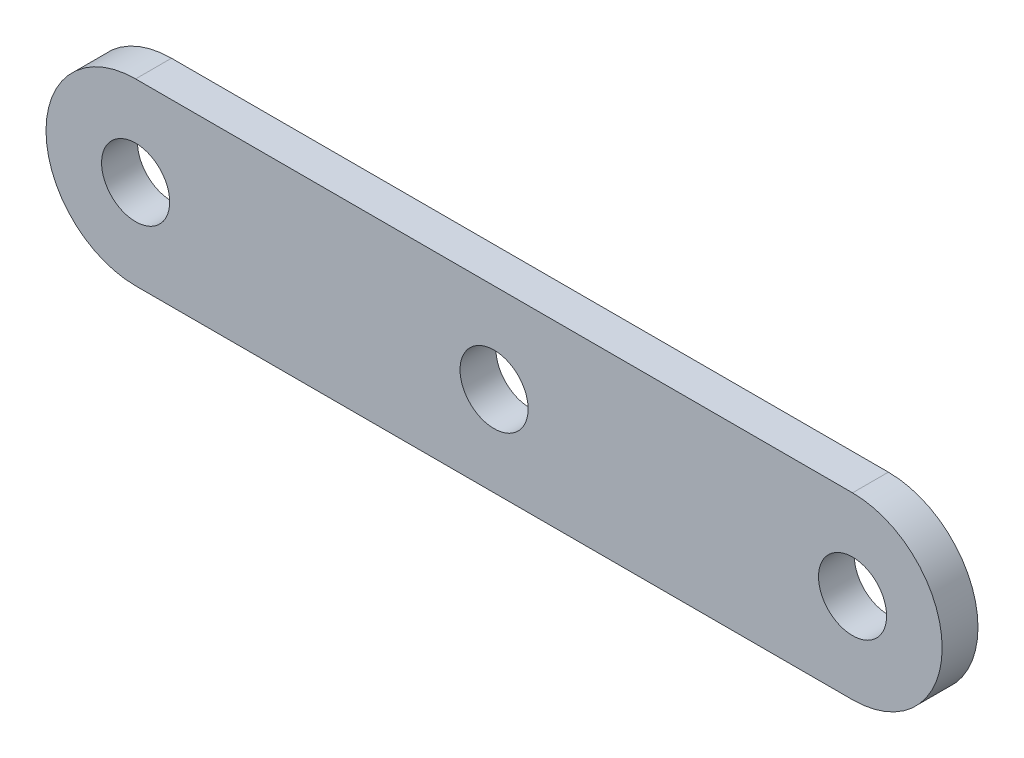
ISO-10303-21;
HEADER;
FILE_DESCRIPTION(('STEP AP214'),'2;1');
FILE_NAME('part.step','',(''),(''),'','','');
FILE_SCHEMA(('AUTOMOTIVE_DESIGN { 1 0 10303 214 1 1 1 1 }'));
ENDSEC;
DATA;
#1=APPLICATION_CONTEXT('core data for automotive mechanical design processes');
#2=APPLICATION_PROTOCOL_DEFINITION('international standard','automotive_design',2000,#1);
#3=PRODUCT_CONTEXT('',#1,'mechanical');
#4=PRODUCT('Part','Part','',(#3));
#5=PRODUCT_RELATED_PRODUCT_CATEGORY('part','',(#4));
#6=PRODUCT_DEFINITION_FORMATION('','',#4);
#7=PRODUCT_DEFINITION_CONTEXT('part definition',#1,'design');
#8=PRODUCT_DEFINITION('design','',#6,#7);
#9=PRODUCT_DEFINITION_SHAPE('','',#8);
#10=(LENGTH_UNIT() NAMED_UNIT(*) SI_UNIT(.MILLI.,.METRE.));
#11=(NAMED_UNIT(*) PLANE_ANGLE_UNIT() SI_UNIT($,.RADIAN.));
#12=(NAMED_UNIT(*) SI_UNIT($,.STERADIAN.) SOLID_ANGLE_UNIT());
#13=UNCERTAINTY_MEASURE_WITH_UNIT(LENGTH_MEASURE(1.E-05),#10,'distance_accuracy_value','');
#14=(GEOMETRIC_REPRESENTATION_CONTEXT(3) GLOBAL_UNCERTAINTY_ASSIGNED_CONTEXT((#13)) GLOBAL_UNIT_ASSIGNED_CONTEXT((#10,
#11,#12)) REPRESENTATION_CONTEXT('',''));
#15=CARTESIAN_POINT('',(0.,0.,0.));
#16=DIRECTION('',(0.,0.,1.));
#17=DIRECTION('',(1.,0.,0.));
#18=AXIS2_PLACEMENT_3D('',#15,#16,#17);
#19=CARTESIAN_POINT('',(-2.54,-5.81121212121212,1.27));
#20=DIRECTION('',(0.,0.,-1.));
#21=DIRECTION('',(-1.,0.,0.));
#22=AXIS2_PLACEMENT_3D('',#19,#20,#21);
#23=CYLINDRICAL_SURFACE('',#22,6.35);
#24=CARTESIAN_POINT('',(-2.54,-5.81121212121212,-1.27));
#25=DIRECTION('',(0.,0.,1.));
#26=DIRECTION('',(1.,0.,0.));
#27=AXIS2_PLACEMENT_3D('',#24,#25,#26);
#28=CIRCLE('',#27,6.35);
#29=CARTESIAN_POINT('',(-2.54,0.538787878787879,-1.27));
#30=VERTEX_POINT('',#29);
#31=CARTESIAN_POINT('',(-2.54,-12.1612121212121,-1.27));
#32=VERTEX_POINT('',#31);
#33=EDGE_CURVE('E104',#30,#32,#28,.T.);
#34=ORIENTED_EDGE('',*,*,#33,.T.);
#35=DIRECTION('',(0.,0.,-1.));
#36=VECTOR('',#35,1.);
#37=CARTESIAN_POINT('',(-2.54,-12.1612121212121,1.27));
#38=LINE('',#37,#36);
#39=CARTESIAN_POINT('',(-2.54,-12.1612121212121,1.27));
#40=VERTEX_POINT('',#39);
#41=EDGE_CURVE('E11',#40,#32,#38,.T.);
#42=ORIENTED_EDGE('',*,*,#41,.F.);
#43=CARTESIAN_POINT('',(-2.54,-5.81121212121212,1.27));
#44=DIRECTION('',(0.,0.,1.));
#45=DIRECTION('',(1.,0.,0.));
#46=AXIS2_PLACEMENT_3D('',#43,#44,#45);
#47=CIRCLE('',#46,6.35);
#48=CARTESIAN_POINT('',(-2.54,0.538787878787879,1.27));
#49=VERTEX_POINT('',#48);
#50=EDGE_CURVE('E92',#49,#40,#47,.T.);
#51=ORIENTED_EDGE('',*,*,#50,.F.);
#52=DIRECTION('',(0.,0.,-1.));
#53=VECTOR('',#52,1.);
#54=CARTESIAN_POINT('',(-2.54,0.538787878787879,1.27));
#55=LINE('',#54,#53);
#56=EDGE_CURVE('E100',#49,#30,#55,.T.);
#57=ORIENTED_EDGE('',*,*,#56,.T.);
#58=EDGE_LOOP('',(#34,#42,#51,#57));
#59=FACE_BOUND('',#58,.T.);
#60=ADVANCED_FACE('F41',(#59),#23,.T.);
#61=CARTESIAN_POINT('',(48.26,-12.1612121212121,1.27));
#62=DIRECTION('',(0.,1.,0.));
#63=DIRECTION('',(-1.,0.,0.));
#64=AXIS2_PLACEMENT_3D('',#61,#62,#63);
#65=PLANE('',#64);
#66=DIRECTION('',(1.,0.,0.));
#67=VECTOR('',#66,1.);
#68=CARTESIAN_POINT('',(48.26,-12.1612121212121,-1.27));
#69=LINE('',#68,#67);
#70=CARTESIAN_POINT('',(48.26,-12.1612121212121,-1.27));
#71=VERTEX_POINT('',#70);
#72=EDGE_CURVE('E96',#32,#71,#69,.T.);
#73=ORIENTED_EDGE('',*,*,#72,.T.);
#74=DIRECTION('',(0.,0.,-1.));
#75=VECTOR('',#74,1.);
#76=CARTESIAN_POINT('',(48.26,-12.1612121212121,1.27));
#77=LINE('',#76,#75);
#78=CARTESIAN_POINT('',(48.26,-12.1612121212121,1.27));
#79=VERTEX_POINT('',#78);
#80=EDGE_CURVE('E49',#79,#71,#77,.T.);
#81=ORIENTED_EDGE('',*,*,#80,.F.);
#82=DIRECTION('',(1.,0.,0.));
#83=VECTOR('',#82,1.);
#84=CARTESIAN_POINT('',(48.26,-12.1612121212121,1.27));
#85=LINE('',#84,#83);
#86=EDGE_CURVE('E87',#40,#79,#85,.T.);
#87=ORIENTED_EDGE('',*,*,#86,.F.);
#88=ORIENTED_EDGE('',*,*,#41,.T.);
#89=EDGE_LOOP('',(#73,#81,#87,#88));
#90=FACE_BOUND('',#89,.T.);
#91=ADVANCED_FACE('F95',(#90),#65,.F.);
#92=CARTESIAN_POINT('',(48.26,-5.81121212121212,1.27));
#93=DIRECTION('',(0.,0.,-1.));
#94=DIRECTION('',(-1.,0.,0.));
#95=AXIS2_PLACEMENT_3D('',#92,#93,#94);
#96=CYLINDRICAL_SURFACE('',#95,6.35);
#97=CARTESIAN_POINT('',(48.26,-5.81121212121212,-1.27));
#98=DIRECTION('',(0.,0.,1.));
#99=DIRECTION('',(-1.,0.,0.));
#100=AXIS2_PLACEMENT_3D('',#97,#98,#99);
#101=CIRCLE('',#100,6.35);
#102=CARTESIAN_POINT('',(48.26,0.538787878787884,-1.27));
#103=VERTEX_POINT('',#102);
#104=EDGE_CURVE('E74',#71,#103,#101,.T.);
#105=ORIENTED_EDGE('',*,*,#104,.T.);
#106=DIRECTION('',(0.,0.,-1.));
#107=VECTOR('',#106,1.);
#108=CARTESIAN_POINT('',(48.26,0.538787878787884,1.27));
#109=LINE('',#108,#107);
#110=CARTESIAN_POINT('',(48.26,0.538787878787884,1.27));
#111=VERTEX_POINT('',#110);
#112=EDGE_CURVE('E97',#111,#103,#109,.T.);
#113=ORIENTED_EDGE('',*,*,#112,.F.);
#114=CARTESIAN_POINT('',(48.26,-5.81121212121212,1.27));
#115=DIRECTION('',(0.,0.,1.));
#116=DIRECTION('',(-1.,0.,0.));
#117=AXIS2_PLACEMENT_3D('',#114,#115,#116);
#118=CIRCLE('',#117,6.35);
#119=EDGE_CURVE('E90',#79,#111,#118,.T.);
#120=ORIENTED_EDGE('',*,*,#119,.F.);
#121=ORIENTED_EDGE('',*,*,#80,.T.);
#122=EDGE_LOOP('',(#105,#113,#120,#121));
#123=FACE_BOUND('',#122,.T.);
#124=ADVANCED_FACE('F98',(#123),#96,.T.);
#125=CARTESIAN_POINT('',(48.26,0.538787878787884,1.27));
#126=DIRECTION('',(0.,-1.,0.));
#127=DIRECTION('',(1.,0.,0.));
#128=AXIS2_PLACEMENT_3D('',#125,#126,#127);
#129=PLANE('',#128);
#130=DIRECTION('',(-1.,0.,0.));
#131=VECTOR('',#130,1.);
#132=CARTESIAN_POINT('',(48.26,0.538787878787884,-1.27));
#133=LINE('',#132,#131);
#134=EDGE_CURVE('E80',#103,#30,#133,.T.);
#135=ORIENTED_EDGE('',*,*,#134,.T.);
#136=ORIENTED_EDGE('',*,*,#56,.F.);
#137=DIRECTION('',(-1.,0.,0.));
#138=VECTOR('',#137,1.);
#139=CARTESIAN_POINT('',(48.26,0.538787878787884,1.27));
#140=LINE('',#139,#138);
#141=EDGE_CURVE('E57',#111,#49,#140,.T.);
#142=ORIENTED_EDGE('',*,*,#141,.F.);
#143=ORIENTED_EDGE('',*,*,#112,.T.);
#144=EDGE_LOOP('',(#135,#136,#142,#143));
#145=FACE_BOUND('',#144,.T.);
#146=ADVANCED_FACE('F112',(#145),#129,.F.);
#147=CARTESIAN_POINT('',(-2.54,-5.81121212121212,1.27));
#148=DIRECTION('',(0.,0.,1.));
#149=DIRECTION('',(1.,0.,0.));
#150=AXIS2_PLACEMENT_3D('',#147,#148,#149);
#151=PLANE('',#150);
#152=CARTESIAN_POINT('',(22.86,-5.81121212121212,1.27));
#153=DIRECTION('',(0.,0.,1.));
#154=DIRECTION('',(1.,0.,0.));
#155=AXIS2_PLACEMENT_3D('',#152,#153,#154);
#156=CIRCLE('',#155,2.413);
#157=CARTESIAN_POINT('',(25.273,-5.81121212121212,1.27));
#158=VERTEX_POINT('',#157);
#159=EDGE_CURVE('E130',#158,#158,#156,.T.);
#160=ORIENTED_EDGE('',*,*,#159,.F.);
#161=EDGE_LOOP('',(#160));
#162=FACE_BOUND('',#161,.T.);
#163=CARTESIAN_POINT('',(48.26,-5.81121212121212,1.27));
#164=DIRECTION('',(0.,0.,1.));
#165=DIRECTION('',(1.,0.,0.));
#166=AXIS2_PLACEMENT_3D('',#163,#164,#165);
#167=CIRCLE('',#166,2.413);
#168=CARTESIAN_POINT('',(50.673,-5.81121212121212,1.27));
#169=VERTEX_POINT('',#168);
#170=EDGE_CURVE('E124',#169,#169,#167,.T.);
#171=ORIENTED_EDGE('',*,*,#170,.F.);
#172=EDGE_LOOP('',(#171));
#173=FACE_BOUND('',#172,.T.);
#174=CARTESIAN_POINT('',(-2.54,-5.81121212121212,1.27));
#175=DIRECTION('',(0.,0.,1.));
#176=DIRECTION('',(1.,0.,0.));
#177=AXIS2_PLACEMENT_3D('',#174,#175,#176);
#178=CIRCLE('',#177,2.413);
#179=CARTESIAN_POINT('',(-0.127,-5.81121212121212,1.27));
#180=VERTEX_POINT('',#179);
#181=EDGE_CURVE('E118',#180,#180,#178,.T.);
#182=ORIENTED_EDGE('',*,*,#181,.F.);
#183=EDGE_LOOP('',(#182));
#184=FACE_BOUND('',#183,.T.);
#185=ORIENTED_EDGE('',*,*,#50,.T.);
#186=ORIENTED_EDGE('',*,*,#86,.T.);
#187=ORIENTED_EDGE('',*,*,#119,.T.);
#188=ORIENTED_EDGE('',*,*,#141,.T.);
#189=EDGE_LOOP('',(#185,#186,#187,#188));
#190=FACE_BOUND('',#189,.T.);
#191=ADVANCED_FACE('F88',(#162,#173,#184,#190),#151,.T.);
#192=CARTESIAN_POINT('',(-2.54,-5.81121212121212,-1.27));
#193=DIRECTION('',(0.,0.,1.));
#194=DIRECTION('',(1.,0.,0.));
#195=AXIS2_PLACEMENT_3D('',#192,#193,#194);
#196=PLANE('',#195);
#197=CARTESIAN_POINT('',(22.86,-5.81121212121212,-1.27));
#198=DIRECTION('',(0.,0.,1.));
#199=DIRECTION('',(1.,0.,0.));
#200=AXIS2_PLACEMENT_3D('',#197,#198,#199);
#201=CIRCLE('',#200,2.413);
#202=CARTESIAN_POINT('',(25.273,-5.81121212121212,-1.27));
#203=VERTEX_POINT('',#202);
#204=EDGE_CURVE('E121',#203,#203,#201,.T.);
#205=ORIENTED_EDGE('',*,*,#204,.T.);
#206=EDGE_LOOP('',(#205));
#207=FACE_BOUND('',#206,.T.);
#208=CARTESIAN_POINT('',(48.26,-5.81121212121212,-1.27));
#209=DIRECTION('',(0.,0.,1.));
#210=DIRECTION('',(1.,0.,0.));
#211=AXIS2_PLACEMENT_3D('',#208,#209,#210);
#212=CIRCLE('',#211,2.413);
#213=CARTESIAN_POINT('',(50.673,-5.81121212121212,-1.27));
#214=VERTEX_POINT('',#213);
#215=EDGE_CURVE('E127',#214,#214,#212,.T.);
#216=ORIENTED_EDGE('',*,*,#215,.T.);
#217=EDGE_LOOP('',(#216));
#218=FACE_BOUND('',#217,.T.);
#219=CARTESIAN_POINT('',(-2.54,-5.81121212121212,-1.27));
#220=DIRECTION('',(0.,0.,1.));
#221=DIRECTION('',(1.,0.,0.));
#222=AXIS2_PLACEMENT_3D('',#219,#220,#221);
#223=CIRCLE('',#222,2.413);
#224=CARTESIAN_POINT('',(-0.127,-5.81121212121212,-1.27));
#225=VERTEX_POINT('',#224);
#226=EDGE_CURVE('E107',#225,#225,#223,.T.);
#227=ORIENTED_EDGE('',*,*,#226,.T.);
#228=EDGE_LOOP('',(#227));
#229=FACE_BOUND('',#228,.T.);
#230=ORIENTED_EDGE('',*,*,#33,.F.);
#231=ORIENTED_EDGE('',*,*,#134,.F.);
#232=ORIENTED_EDGE('',*,*,#104,.F.);
#233=ORIENTED_EDGE('',*,*,#72,.F.);
#234=EDGE_LOOP('',(#230,#231,#232,#233));
#235=FACE_BOUND('',#234,.T.);
#236=ADVANCED_FACE('F115',(#207,#218,#229,#235),#196,.F.);
#237=CARTESIAN_POINT('',(-2.54,-5.81121212121212,-1.27));
#238=DIRECTION('',(0.,0.,1.));
#239=DIRECTION('',(1.,0.,0.));
#240=AXIS2_PLACEMENT_3D('',#237,#238,#239);
#241=CYLINDRICAL_SURFACE('',#240,2.413);
#242=ORIENTED_EDGE('',*,*,#226,.F.);
#243=EDGE_LOOP('',(#242));
#244=FACE_BOUND('',#243,.T.);
#245=ORIENTED_EDGE('',*,*,#181,.T.);
#246=EDGE_LOOP('',(#245));
#247=FACE_BOUND('',#246,.T.);
#248=ADVANCED_FACE('F152',(#244,#247),#241,.F.);
#249=CARTESIAN_POINT('',(48.26,-5.81121212121212,-1.27));
#250=DIRECTION('',(0.,0.,1.));
#251=DIRECTION('',(1.,0.,0.));
#252=AXIS2_PLACEMENT_3D('',#249,#250,#251);
#253=CYLINDRICAL_SURFACE('',#252,2.413);
#254=ORIENTED_EDGE('',*,*,#215,.F.);
#255=EDGE_LOOP('',(#254));
#256=FACE_BOUND('',#255,.T.);
#257=ORIENTED_EDGE('',*,*,#170,.T.);
#258=EDGE_LOOP('',(#257));
#259=FACE_BOUND('',#258,.T.);
#260=ADVANCED_FACE('F141',(#256,#259),#253,.F.);
#261=CARTESIAN_POINT('',(22.86,-5.81121212121212,-1.27));
#262=DIRECTION('',(0.,0.,1.));
#263=DIRECTION('',(1.,0.,0.));
#264=AXIS2_PLACEMENT_3D('',#261,#262,#263);
#265=CYLINDRICAL_SURFACE('',#264,2.413);
#266=ORIENTED_EDGE('',*,*,#204,.F.);
#267=EDGE_LOOP('',(#266));
#268=FACE_BOUND('',#267,.T.);
#269=ORIENTED_EDGE('',*,*,#159,.T.);
#270=EDGE_LOOP('',(#269));
#271=FACE_BOUND('',#270,.T.);
#272=ADVANCED_FACE('F138',(#268,#271),#265,.F.);
#273=CLOSED_SHELL('',(#60,#91,#124,#146,#191,#236,#248,#260,#272));
#274=MANIFOLD_SOLID_BREP('B2',#273);
#275=ADVANCED_BREP_SHAPE_REPRESENTATION('',(#18,#274),#14);
#276=SHAPE_DEFINITION_REPRESENTATION(#9,#275);
ENDSEC;
END-ISO-10303-21;
